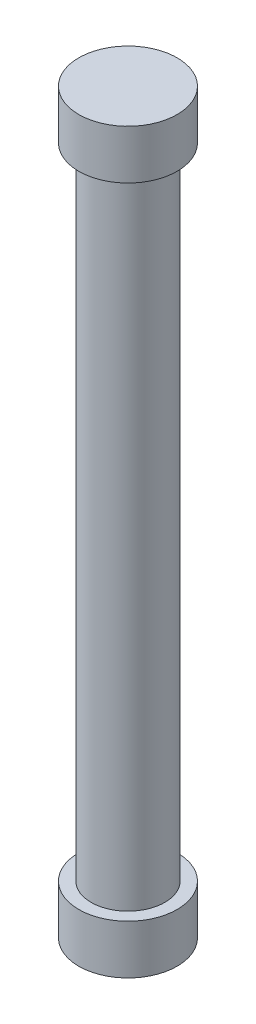
ISO-10303-21;
HEADER;
FILE_DESCRIPTION(('STEP AP214'),'2;1');
FILE_NAME('part.step','',(''),(''),'','','');
FILE_SCHEMA(('AUTOMOTIVE_DESIGN { 1 0 10303 214 1 1 1 1 }'));
ENDSEC;
DATA;
#1=APPLICATION_CONTEXT('core data for automotive mechanical design processes');
#2=APPLICATION_PROTOCOL_DEFINITION('international standard','automotive_design',2000,#1);
#3=PRODUCT_CONTEXT('',#1,'mechanical');
#4=PRODUCT('Part','Part','',(#3));
#5=PRODUCT_RELATED_PRODUCT_CATEGORY('part','',(#4));
#6=PRODUCT_DEFINITION_FORMATION('','',#4);
#7=PRODUCT_DEFINITION_CONTEXT('part definition',#1,'design');
#8=PRODUCT_DEFINITION('design','',#6,#7);
#9=PRODUCT_DEFINITION_SHAPE('','',#8);
#10=(LENGTH_UNIT() NAMED_UNIT(*) SI_UNIT(.MILLI.,.METRE.));
#11=(NAMED_UNIT(*) PLANE_ANGLE_UNIT() SI_UNIT($,.RADIAN.));
#12=(NAMED_UNIT(*) SI_UNIT($,.STERADIAN.) SOLID_ANGLE_UNIT());
#13=UNCERTAINTY_MEASURE_WITH_UNIT(LENGTH_MEASURE(1.E-05),#10,'distance_accuracy_value','');
#14=(GEOMETRIC_REPRESENTATION_CONTEXT(3) GLOBAL_UNCERTAINTY_ASSIGNED_CONTEXT((#13)) GLOBAL_UNIT_ASSIGNED_CONTEXT((#10,
#11,#12)) REPRESENTATION_CONTEXT('',''));
#15=CARTESIAN_POINT('',(0.,0.,0.));
#16=DIRECTION('',(0.,0.,1.));
#17=DIRECTION('',(1.,0.,0.));
#18=AXIS2_PLACEMENT_3D('',#15,#16,#17);
#19=CARTESIAN_POINT('',(-2.,15.,0.));
#20=DIRECTION('',(0.,1.,0.));
#21=DIRECTION('',(0.,0.,1.));
#22=AXIS2_PLACEMENT_3D('',#19,#20,#21);
#23=PLANE('',#22);
#24=CARTESIAN_POINT('',(0.,15.,0.));
#25=DIRECTION('',(0.,1.,0.));
#26=DIRECTION('',(0.,0.,1.));
#27=AXIS2_PLACEMENT_3D('',#24,#25,#26);
#28=CIRCLE('',#27,2.);
#29=CARTESIAN_POINT('',(0.,15.,2.));
#30=VERTEX_POINT('',#29);
#31=EDGE_CURVE('E63',#30,#30,#28,.T.);
#32=ORIENTED_EDGE('',*,*,#31,.T.);
#33=EDGE_LOOP('',(#32));
#34=FACE_BOUND('',#33,.T.);
#35=ADVANCED_FACE('F41',(#34),#23,.T.);
#36=CARTESIAN_POINT('',(0.,-15.,0.));
#37=DIRECTION('',(0.,-1.,0.));
#38=DIRECTION('',(0.,0.,-1.));
#39=AXIS2_PLACEMENT_3D('',#36,#37,#38);
#40=PLANE('',#39);
#41=CARTESIAN_POINT('',(0.,-15.,0.));
#42=DIRECTION('',(0.,1.,0.));
#43=DIRECTION('',(0.,0.,1.));
#44=AXIS2_PLACEMENT_3D('',#41,#42,#43);
#45=CIRCLE('',#44,2.);
#46=CARTESIAN_POINT('',(0.,-15.,2.));
#47=VERTEX_POINT('',#46);
#48=EDGE_CURVE('E10',#47,#47,#45,.T.);
#49=ORIENTED_EDGE('',*,*,#48,.F.);
#50=EDGE_LOOP('',(#49));
#51=FACE_BOUND('',#50,.T.);
#52=ADVANCED_FACE('F80',(#51),#40,.T.);
#53=CARTESIAN_POINT('',(0.,15.,0.));
#54=DIRECTION('',(0.,1.,0.));
#55=DIRECTION('',(0.,0.,1.));
#56=AXIS2_PLACEMENT_3D('',#53,#54,#55);
#57=CYLINDRICAL_SURFACE('',#56,2.);
#58=ORIENTED_EDGE('',*,*,#48,.T.);
#59=EDGE_LOOP('',(#58));
#60=FACE_BOUND('',#59,.T.);
#61=CARTESIAN_POINT('',(0.,-13.,0.));
#62=DIRECTION('',(0.,1.,0.));
#63=DIRECTION('',(0.,0.,1.));
#64=AXIS2_PLACEMENT_3D('',#61,#62,#63);
#65=CIRCLE('',#64,2.);
#66=CARTESIAN_POINT('',(0.,-13.,2.));
#67=VERTEX_POINT('',#66);
#68=EDGE_CURVE('E47',#67,#67,#65,.T.);
#69=ORIENTED_EDGE('',*,*,#68,.F.);
#70=EDGE_LOOP('',(#69));
#71=FACE_BOUND('',#70,.T.);
#72=ADVANCED_FACE('F84',(#60,#71),#57,.T.);
#73=CARTESIAN_POINT('',(-2.,-13.,0.));
#74=DIRECTION('',(0.,1.,0.));
#75=DIRECTION('',(0.,0.,1.));
#76=AXIS2_PLACEMENT_3D('',#73,#74,#75);
#77=PLANE('',#76);
#78=ORIENTED_EDGE('',*,*,#68,.T.);
#79=EDGE_LOOP('',(#78));
#80=FACE_BOUND('',#79,.T.);
#81=CARTESIAN_POINT('',(0.,-13.,0.));
#82=DIRECTION('',(0.,1.,0.));
#83=DIRECTION('',(0.,0.,1.));
#84=AXIS2_PLACEMENT_3D('',#81,#82,#83);
#85=CIRCLE('',#84,1.5);
#86=CARTESIAN_POINT('',(0.,-13.,1.5));
#87=VERTEX_POINT('',#86);
#88=EDGE_CURVE('E51',#87,#87,#85,.T.);
#89=ORIENTED_EDGE('',*,*,#88,.F.);
#90=EDGE_LOOP('',(#89));
#91=FACE_BOUND('',#90,.T.);
#92=ADVANCED_FACE('F89',(#80,#91),#77,.T.);
#93=CARTESIAN_POINT('',(0.,15.,0.));
#94=DIRECTION('',(0.,1.,0.));
#95=DIRECTION('',(0.,0.,1.));
#96=AXIS2_PLACEMENT_3D('',#93,#94,#95);
#97=CYLINDRICAL_SURFACE('',#96,1.5);
#98=ORIENTED_EDGE('',*,*,#88,.T.);
#99=EDGE_LOOP('',(#98));
#100=FACE_BOUND('',#99,.T.);
#101=CARTESIAN_POINT('',(0.,13.,0.));
#102=DIRECTION('',(0.,1.,0.));
#103=DIRECTION('',(0.,0.,1.));
#104=AXIS2_PLACEMENT_3D('',#101,#102,#103);
#105=CIRCLE('',#104,1.5);
#106=CARTESIAN_POINT('',(0.,13.,1.5));
#107=VERTEX_POINT('',#106);
#108=EDGE_CURVE('E55',#107,#107,#105,.T.);
#109=ORIENTED_EDGE('',*,*,#108,.F.);
#110=EDGE_LOOP('',(#109));
#111=FACE_BOUND('',#110,.T.);
#112=ADVANCED_FACE('F76',(#100,#111),#97,.T.);
#113=CARTESIAN_POINT('',(-1.5,13.,0.));
#114=DIRECTION('',(0.,-1.,0.));
#115=DIRECTION('',(0.,0.,-1.));
#116=AXIS2_PLACEMENT_3D('',#113,#114,#115);
#117=PLANE('',#116);
#118=ORIENTED_EDGE('',*,*,#108,.T.);
#119=EDGE_LOOP('',(#118));
#120=FACE_BOUND('',#119,.T.);
#121=CARTESIAN_POINT('',(0.,13.,0.));
#122=DIRECTION('',(0.,1.,0.));
#123=DIRECTION('',(0.,0.,1.));
#124=AXIS2_PLACEMENT_3D('',#121,#122,#123);
#125=CIRCLE('',#124,2.);
#126=CARTESIAN_POINT('',(0.,13.,2.));
#127=VERTEX_POINT('',#126);
#128=EDGE_CURVE('E60',#127,#127,#125,.T.);
#129=ORIENTED_EDGE('',*,*,#128,.F.);
#130=EDGE_LOOP('',(#129));
#131=FACE_BOUND('',#130,.T.);
#132=ADVANCED_FACE('F70',(#120,#131),#117,.T.);
#133=CARTESIAN_POINT('',(0.,15.,0.));
#134=DIRECTION('',(0.,1.,0.));
#135=DIRECTION('',(0.,0.,1.));
#136=AXIS2_PLACEMENT_3D('',#133,#134,#135);
#137=CYLINDRICAL_SURFACE('',#136,2.);
#138=ORIENTED_EDGE('',*,*,#128,.T.);
#139=EDGE_LOOP('',(#138));
#140=FACE_BOUND('',#139,.T.);
#141=ORIENTED_EDGE('',*,*,#31,.F.);
#142=EDGE_LOOP('',(#141));
#143=FACE_BOUND('',#142,.T.);
#144=ADVANCED_FACE('F68',(#140,#143),#137,.T.);
#145=CLOSED_SHELL('',(#35,#52,#72,#92,#112,#132,#144));
#146=MANIFOLD_SOLID_BREP('B2',#145);
#147=ADVANCED_BREP_SHAPE_REPRESENTATION('',(#18,#146),#14);
#148=SHAPE_DEFINITION_REPRESENTATION(#9,#147);
ENDSEC;
END-ISO-10303-21;
